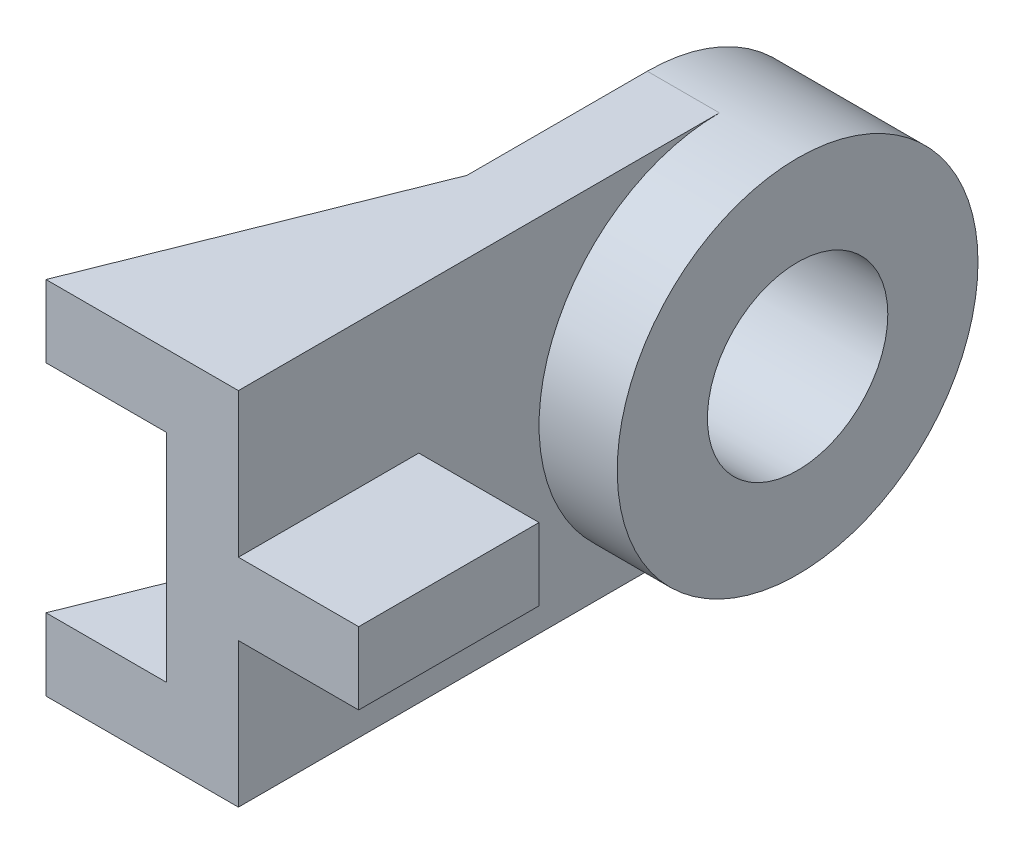
ISO-10303-21;
HEADER;
FILE_DESCRIPTION(('STEP AP214'),'2;1');
FILE_NAME('part.step','',(''),(''),'','','');
FILE_SCHEMA(('AUTOMOTIVE_DESIGN { 1 0 10303 214 1 1 1 1 }'));
ENDSEC;
DATA;
#1=APPLICATION_CONTEXT('core data for automotive mechanical design processes');
#2=APPLICATION_PROTOCOL_DEFINITION('international standard','automotive_design',2000,#1);
#3=PRODUCT_CONTEXT('',#1,'mechanical');
#4=PRODUCT('Part','Part','',(#3));
#5=PRODUCT_RELATED_PRODUCT_CATEGORY('part','',(#4));
#6=PRODUCT_DEFINITION_FORMATION('','',#4);
#7=PRODUCT_DEFINITION_CONTEXT('part definition',#1,'design');
#8=PRODUCT_DEFINITION('design','',#6,#7);
#9=PRODUCT_DEFINITION_SHAPE('','',#8);
#10=(LENGTH_UNIT() NAMED_UNIT(*) SI_UNIT(.MILLI.,.METRE.));
#11=(NAMED_UNIT(*) PLANE_ANGLE_UNIT() SI_UNIT($,.RADIAN.));
#12=(NAMED_UNIT(*) SI_UNIT($,.STERADIAN.) SOLID_ANGLE_UNIT());
#13=UNCERTAINTY_MEASURE_WITH_UNIT(LENGTH_MEASURE(1.E-05),#10,'distance_accuracy_value','');
#14=(GEOMETRIC_REPRESENTATION_CONTEXT(3) GLOBAL_UNCERTAINTY_ASSIGNED_CONTEXT((#13)) GLOBAL_UNIT_ASSIGNED_CONTEXT((#10,
#11,#12)) REPRESENTATION_CONTEXT('',''));
#15=CARTESIAN_POINT('',(0.,0.,0.));
#16=DIRECTION('',(0.,0.,1.));
#17=DIRECTION('',(1.,0.,0.));
#18=AXIS2_PLACEMENT_3D('',#15,#16,#17);
#19=CARTESIAN_POINT('',(0.,0.,0.));
#20=DIRECTION('',(1.,0.,0.));
#21=DIRECTION('',(0.,0.,-1.));
#22=AXIS2_PLACEMENT_3D('',#19,#20,#21);
#23=PLANE('',#22);
#24=CARTESIAN_POINT('',(0.,0.,0.));
#25=DIRECTION('',(1.,0.,0.));
#26=DIRECTION('',(0.,0.,-1.));
#27=AXIS2_PLACEMENT_3D('',#24,#25,#26);
#28=CIRCLE('',#27,15.);
#29=CARTESIAN_POINT('',(0.,0.,-15.));
#30=VERTEX_POINT('',#29);
#31=EDGE_CURVE('E152',#30,#30,#28,.T.);
#32=ORIENTED_EDGE('',*,*,#31,.T.);
#33=EDGE_LOOP('',(#32));
#34=FACE_BOUND('',#33,.T.);
#35=DIRECTION('',(0.,-1.,0.));
#36=VECTOR('',#35,1.);
#37=CARTESIAN_POINT('',(0.,-18.,30.));
#38=LINE('',#37,#36);
#39=CARTESIAN_POINT('',(0.,-18.,30.));
#40=VERTEX_POINT('',#39);
#41=CARTESIAN_POINT('',(0.,-30.,30.));
#42=VERTEX_POINT('',#41);
#43=EDGE_CURVE('E55',#40,#42,#38,.T.);
#44=ORIENTED_EDGE('',*,*,#43,.F.);
#45=DIRECTION('',(0.,0.,-1.));
#46=VECTOR('',#45,1.);
#47=CARTESIAN_POINT('',(0.,-18.,30.));
#48=LINE('',#47,#46);
#49=CARTESIAN_POINT('',(0.,-18.,80.));
#50=VERTEX_POINT('',#49);
#51=EDGE_CURVE('E133',#50,#40,#48,.T.);
#52=ORIENTED_EDGE('',*,*,#51,.F.);
#53=DIRECTION('',(0.,1.,0.));
#54=VECTOR('',#53,1.);
#55=CARTESIAN_POINT('',(0.,0.,80.));
#56=LINE('',#55,#54);
#57=CARTESIAN_POINT('',(0.,18.,80.));
#58=VERTEX_POINT('',#57);
#59=EDGE_CURVE('E146',#50,#58,#56,.T.);
#60=ORIENTED_EDGE('',*,*,#59,.T.);
#61=DIRECTION('',(0.,0.,-1.));
#62=VECTOR('',#61,1.);
#63=CARTESIAN_POINT('',(0.,18.,30.));
#64=LINE('',#63,#62);
#65=CARTESIAN_POINT('',(0.,18.,30.));
#66=VERTEX_POINT('',#65);
#67=EDGE_CURVE('E155',#58,#66,#64,.T.);
#68=ORIENTED_EDGE('',*,*,#67,.T.);
#69=DIRECTION('',(0.,1.,0.));
#70=VECTOR('',#69,1.);
#71=CARTESIAN_POINT('',(0.,18.,30.));
#72=LINE('',#71,#70);
#73=CARTESIAN_POINT('',(0.,30.,30.));
#74=VERTEX_POINT('',#73);
#75=EDGE_CURVE('E163',#66,#74,#72,.T.);
#76=ORIENTED_EDGE('',*,*,#75,.T.);
#77=DIRECTION('',(0.,0.,-1.));
#78=VECTOR('',#77,1.);
#79=CARTESIAN_POINT('',(0.,30.,0.));
#80=LINE('',#79,#78);
#81=CARTESIAN_POINT('',(0.,30.,0.));
#82=VERTEX_POINT('',#81);
#83=EDGE_CURVE('E202',#74,#82,#80,.T.);
#84=ORIENTED_EDGE('',*,*,#83,.T.);
#85=CARTESIAN_POINT('',(0.,0.,0.));
#86=DIRECTION('',(1.,0.,0.));
#87=DIRECTION('',(0.,0.,-1.));
#88=AXIS2_PLACEMENT_3D('',#85,#86,#87);
#89=CIRCLE('',#88,30.);
#90=CARTESIAN_POINT('',(0.,-30.,0.));
#91=VERTEX_POINT('',#90);
#92=EDGE_CURVE('E198',#91,#82,#89,.T.);
#93=ORIENTED_EDGE('',*,*,#92,.F.);
#94=DIRECTION('',(0.,0.,1.));
#95=VECTOR('',#94,1.);
#96=CARTESIAN_POINT('',(0.,-30.,0.));
#97=LINE('',#96,#95);
#98=EDGE_CURVE('E60',#91,#42,#97,.T.);
#99=ORIENTED_EDGE('',*,*,#98,.T.);
#100=EDGE_LOOP('',(#44,#52,#60,#68,#76,#84,#93,#99));
#101=FACE_BOUND('',#100,.T.);
#102=ADVANCED_FACE('F39',(#34,#101),#23,.F.);
#103=CARTESIAN_POINT('',(12.,30.,0.));
#104=DIRECTION('',(0.,1.,0.));
#105=DIRECTION('',(0.,0.,1.));
#106=AXIS2_PLACEMENT_3D('',#103,#104,#105);
#107=PLANE('',#106);
#108=ORIENTED_EDGE('',*,*,#83,.F.);
#109=DIRECTION('',(-0.371390676354104,0.,0.928476690885259));
#110=VECTOR('',#109,1.);
#111=CARTESIAN_POINT('',(-20.,30.,80.));
#112=LINE('',#111,#110);
#113=CARTESIAN_POINT('',(-20.,30.,80.));
#114=VERTEX_POINT('',#113);
#115=EDGE_CURVE('E153',#74,#114,#112,.T.);
#116=ORIENTED_EDGE('',*,*,#115,.T.);
#117=DIRECTION('',(-1.,0.,0.));
#118=VECTOR('',#117,1.);
#119=CARTESIAN_POINT('',(12.,30.,80.));
#120=LINE('',#119,#118);
#121=CARTESIAN_POINT('',(12.,30.,80.));
#122=VERTEX_POINT('',#121);
#123=EDGE_CURVE('E48',#122,#114,#120,.T.);
#124=ORIENTED_EDGE('',*,*,#123,.F.);
#125=DIRECTION('',(0.,0.,-1.));
#126=VECTOR('',#125,1.);
#127=CARTESIAN_POINT('',(12.,30.,0.));
#128=LINE('',#127,#126);
#129=CARTESIAN_POINT('',(12.,30.,0.));
#130=VERTEX_POINT('',#129);
#131=EDGE_CURVE('E207',#122,#130,#128,.T.);
#132=ORIENTED_EDGE('',*,*,#131,.T.);
#133=DIRECTION('',(-1.,0.,0.));
#134=VECTOR('',#133,1.);
#135=CARTESIAN_POINT('',(12.,30.,0.));
#136=LINE('',#135,#134);
#137=EDGE_CURVE('E11',#130,#82,#136,.T.);
#138=ORIENTED_EDGE('',*,*,#137,.T.);
#139=EDGE_LOOP('',(#108,#116,#124,#132,#138));
#140=FACE_BOUND('',#139,.T.);
#141=ADVANCED_FACE('F41',(#140),#107,.T.);
#142=CARTESIAN_POINT('',(12.,0.,80.));
#143=DIRECTION('',(0.,0.,1.));
#144=DIRECTION('',(1.,0.,0.));
#145=AXIS2_PLACEMENT_3D('',#142,#143,#144);
#146=PLANE('',#145);
#147=ORIENTED_EDGE('',*,*,#59,.F.);
#148=DIRECTION('',(1.,0.,0.));
#149=VECTOR('',#148,1.);
#150=CARTESIAN_POINT('',(0.,-18.,80.));
#151=LINE('',#150,#149);
#152=CARTESIAN_POINT('',(-20.,-18.,80.));
#153=VERTEX_POINT('',#152);
#154=EDGE_CURVE('E132',#153,#50,#151,.T.);
#155=ORIENTED_EDGE('',*,*,#154,.F.);
#156=DIRECTION('',(0.,-1.,0.));
#157=VECTOR('',#156,1.);
#158=CARTESIAN_POINT('',(-20.,-18.,80.));
#159=LINE('',#158,#157);
#160=CARTESIAN_POINT('',(-20.,-30.,80.));
#161=VERTEX_POINT('',#160);
#162=EDGE_CURVE('E135',#153,#161,#159,.T.);
#163=ORIENTED_EDGE('',*,*,#162,.T.);
#164=DIRECTION('',(-1.,0.,0.));
#165=VECTOR('',#164,1.);
#166=CARTESIAN_POINT('',(12.,-30.,80.));
#167=LINE('',#166,#165);
#168=CARTESIAN_POINT('',(12.,-30.,80.));
#169=VERTEX_POINT('',#168);
#170=EDGE_CURVE('E223',#169,#161,#167,.T.);
#171=ORIENTED_EDGE('',*,*,#170,.F.);
#172=DIRECTION('',(0.,1.,0.));
#173=VECTOR('',#172,1.);
#174=CARTESIAN_POINT('',(12.,0.,80.));
#175=LINE('',#174,#173);
#176=CARTESIAN_POINT('',(12.,-6.,80.));
#177=VERTEX_POINT('',#176);
#178=EDGE_CURVE('E211',#169,#177,#175,.T.);
#179=ORIENTED_EDGE('',*,*,#178,.T.);
#180=DIRECTION('',(1.,0.,0.));
#181=VECTOR('',#180,1.);
#182=CARTESIAN_POINT('',(12.,-6.,80.));
#183=LINE('',#182,#181);
#184=CARTESIAN_POINT('',(32.,-6.,80.));
#185=VERTEX_POINT('',#184);
#186=EDGE_CURVE('E185',#177,#185,#183,.T.);
#187=ORIENTED_EDGE('',*,*,#186,.T.);
#188=DIRECTION('',(0.,-1.,0.));
#189=VECTOR('',#188,1.);
#190=CARTESIAN_POINT('',(32.,6.,80.));
#191=LINE('',#190,#189);
#192=CARTESIAN_POINT('',(32.,6.,80.));
#193=VERTEX_POINT('',#192);
#194=EDGE_CURVE('E195',#193,#185,#191,.T.);
#195=ORIENTED_EDGE('',*,*,#194,.F.);
#196=DIRECTION('',(1.,0.,0.));
#197=VECTOR('',#196,1.);
#198=CARTESIAN_POINT('',(12.,6.,80.));
#199=LINE('',#198,#197);
#200=CARTESIAN_POINT('',(12.,6.,80.));
#201=VERTEX_POINT('',#200);
#202=EDGE_CURVE('E175',#201,#193,#199,.T.);
#203=ORIENTED_EDGE('',*,*,#202,.F.);
#204=EDGE_CURVE('E210',#201,#122,#175,.T.);
#205=ORIENTED_EDGE('',*,*,#204,.T.);
#206=ORIENTED_EDGE('',*,*,#123,.T.);
#207=DIRECTION('',(0.,1.,0.));
#208=VECTOR('',#207,1.);
#209=CARTESIAN_POINT('',(-20.,18.,80.));
#210=LINE('',#209,#208);
#211=CARTESIAN_POINT('',(-20.,18.,80.));
#212=VERTEX_POINT('',#211);
#213=EDGE_CURVE('E166',#212,#114,#210,.T.);
#214=ORIENTED_EDGE('',*,*,#213,.F.);
#215=DIRECTION('',(1.,0.,0.));
#216=VECTOR('',#215,1.);
#217=CARTESIAN_POINT('',(0.,18.,80.));
#218=LINE('',#217,#216);
#219=EDGE_CURVE('E161',#212,#58,#218,.T.);
#220=ORIENTED_EDGE('',*,*,#219,.T.);
#221=EDGE_LOOP('',(#147,#155,#163,#171,#179,#187,#195,#203,#205,#206,#214,#220));
#222=FACE_BOUND('',#221,.T.);
#223=ADVANCED_FACE('F144',(#222),#146,.T.);
#224=CARTESIAN_POINT('',(12.,-30.,0.));
#225=DIRECTION('',(0.,-1.,0.));
#226=DIRECTION('',(0.,0.,-1.));
#227=AXIS2_PLACEMENT_3D('',#224,#225,#226);
#228=PLANE('',#227);
#229=ORIENTED_EDGE('',*,*,#98,.F.);
#230=DIRECTION('',(-1.,0.,0.));
#231=VECTOR('',#230,1.);
#232=CARTESIAN_POINT('',(12.,-30.,0.));
#233=LINE('',#232,#231);
#234=CARTESIAN_POINT('',(12.,-30.,0.));
#235=VERTEX_POINT('',#234);
#236=EDGE_CURVE('E217',#235,#91,#233,.T.);
#237=ORIENTED_EDGE('',*,*,#236,.F.);
#238=DIRECTION('',(0.,0.,1.));
#239=VECTOR('',#238,1.);
#240=CARTESIAN_POINT('',(12.,-30.,0.));
#241=LINE('',#240,#239);
#242=EDGE_CURVE('E214',#235,#169,#241,.T.);
#243=ORIENTED_EDGE('',*,*,#242,.T.);
#244=ORIENTED_EDGE('',*,*,#170,.T.);
#245=DIRECTION('',(-0.371390676354104,0.,0.928476690885259));
#246=VECTOR('',#245,1.);
#247=CARTESIAN_POINT('',(-20.,-30.,80.));
#248=LINE('',#247,#246);
#249=EDGE_CURVE('E140',#42,#161,#248,.T.);
#250=ORIENTED_EDGE('',*,*,#249,.F.);
#251=EDGE_LOOP('',(#229,#237,#243,#244,#250));
#252=FACE_BOUND('',#251,.T.);
#253=ADVANCED_FACE('F240',(#252),#228,.T.);
#254=CARTESIAN_POINT('',(12.,0.,0.));
#255=DIRECTION('',(1.,0.,0.));
#256=DIRECTION('',(0.,0.,-1.));
#257=AXIS2_PLACEMENT_3D('',#254,#255,#256);
#258=PLANE('',#257);
#259=DIRECTION('',(0.,0.,1.));
#260=VECTOR('',#259,1.);
#261=CARTESIAN_POINT('',(12.,6.,50.));
#262=LINE('',#261,#260);
#263=CARTESIAN_POINT('',(12.,6.,50.));
#264=VERTEX_POINT('',#263);
#265=EDGE_CURVE('E172',#264,#201,#262,.T.);
#266=ORIENTED_EDGE('',*,*,#265,.F.);
#267=DIRECTION('',(0.,-1.,0.));
#268=VECTOR('',#267,1.);
#269=CARTESIAN_POINT('',(12.,6.,50.));
#270=LINE('',#269,#268);
#271=CARTESIAN_POINT('',(12.,-6.,50.));
#272=VERTEX_POINT('',#271);
#273=EDGE_CURVE('E182',#264,#272,#270,.T.);
#274=ORIENTED_EDGE('',*,*,#273,.T.);
#275=DIRECTION('',(0.,0.,1.));
#276=VECTOR('',#275,1.);
#277=CARTESIAN_POINT('',(12.,-6.,50.));
#278=LINE('',#277,#276);
#279=EDGE_CURVE('E169',#272,#177,#278,.T.);
#280=ORIENTED_EDGE('',*,*,#279,.T.);
#281=ORIENTED_EDGE('',*,*,#178,.F.);
#282=ORIENTED_EDGE('',*,*,#242,.F.);
#283=CARTESIAN_POINT('',(12.,0.,0.));
#284=DIRECTION('',(1.,0.,0.));
#285=DIRECTION('',(0.,0.,-1.));
#286=AXIS2_PLACEMENT_3D('',#283,#284,#285);
#287=CIRCLE('',#286,30.);
#288=EDGE_CURVE('E205',#130,#235,#287,.T.);
#289=ORIENTED_EDGE('',*,*,#288,.F.);
#290=ORIENTED_EDGE('',*,*,#131,.F.);
#291=ORIENTED_EDGE('',*,*,#204,.F.);
#292=EDGE_LOOP('',(#266,#274,#280,#281,#282,#289,#290,#291));
#293=FACE_BOUND('',#292,.T.);
#294=ADVANCED_FACE('F244',(#293),#258,.T.);
#295=CARTESIAN_POINT('',(25.,0.,0.));
#296=DIRECTION('',(-1.,0.,0.));
#297=DIRECTION('',(0.,0.,1.));
#298=AXIS2_PLACEMENT_3D('',#295,#296,#297);
#299=CYLINDRICAL_SURFACE('',#298,30.);
#300=CARTESIAN_POINT('',(25.,0.,0.));
#301=DIRECTION('',(1.,0.,0.));
#302=DIRECTION('',(0.,0.,-1.));
#303=AXIS2_PLACEMENT_3D('',#300,#301,#302);
#304=CIRCLE('',#303,30.);
#305=CARTESIAN_POINT('',(25.,0.,-30.));
#306=VERTEX_POINT('',#305);
#307=EDGE_CURVE('E199',#306,#306,#304,.T.);
#308=ORIENTED_EDGE('',*,*,#307,.F.);
#309=EDGE_LOOP('',(#308));
#310=FACE_BOUND('',#309,.T.);
#311=ORIENTED_EDGE('',*,*,#92,.T.);
#312=ORIENTED_EDGE('',*,*,#137,.F.);
#313=ORIENTED_EDGE('',*,*,#288,.T.);
#314=ORIENTED_EDGE('',*,*,#236,.T.);
#315=EDGE_LOOP('',(#311,#312,#313,#314));
#316=FACE_BOUND('',#315,.T.);
#317=ADVANCED_FACE('F235',(#310,#316),#299,.T.);
#318=CARTESIAN_POINT('',(25.,0.,0.));
#319=DIRECTION('',(1.,0.,0.));
#320=DIRECTION('',(0.,0.,-1.));
#321=AXIS2_PLACEMENT_3D('',#318,#319,#320);
#322=PLANE('',#321);
#323=CARTESIAN_POINT('',(25.,0.,0.));
#324=DIRECTION('',(1.,0.,0.));
#325=DIRECTION('',(0.,0.,-1.));
#326=AXIS2_PLACEMENT_3D('',#323,#324,#325);
#327=CIRCLE('',#326,15.);
#328=CARTESIAN_POINT('',(25.,0.,-15.));
#329=VERTEX_POINT('',#328);
#330=EDGE_CURVE('E43',#329,#329,#327,.T.);
#331=ORIENTED_EDGE('',*,*,#330,.F.);
#332=EDGE_LOOP('',(#331));
#333=FACE_BOUND('',#332,.T.);
#334=ORIENTED_EDGE('',*,*,#307,.T.);
#335=EDGE_LOOP('',(#334));
#336=FACE_BOUND('',#335,.T.);
#337=ADVANCED_FACE('F268',(#333,#336),#322,.T.);
#338=CARTESIAN_POINT('',(32.,6.,80.));
#339=DIRECTION('',(-1.,0.,0.));
#340=DIRECTION('',(0.,0.,1.));
#341=AXIS2_PLACEMENT_3D('',#338,#339,#340);
#342=PLANE('',#341);
#343=DIRECTION('',(0.,0.,-1.));
#344=VECTOR('',#343,1.);
#345=CARTESIAN_POINT('',(32.,-6.,80.));
#346=LINE('',#345,#344);
#347=CARTESIAN_POINT('',(32.,-6.,50.));
#348=VERTEX_POINT('',#347);
#349=EDGE_CURVE('E187',#185,#348,#346,.T.);
#350=ORIENTED_EDGE('',*,*,#349,.T.);
#351=DIRECTION('',(0.,-1.,0.));
#352=VECTOR('',#351,1.);
#353=CARTESIAN_POINT('',(32.,6.,50.));
#354=LINE('',#353,#352);
#355=CARTESIAN_POINT('',(32.,6.,50.));
#356=VERTEX_POINT('',#355);
#357=EDGE_CURVE('E192',#356,#348,#354,.T.);
#358=ORIENTED_EDGE('',*,*,#357,.F.);
#359=DIRECTION('',(0.,0.,-1.));
#360=VECTOR('',#359,1.);
#361=CARTESIAN_POINT('',(32.,6.,80.));
#362=LINE('',#361,#360);
#363=EDGE_CURVE('E178',#193,#356,#362,.T.);
#364=ORIENTED_EDGE('',*,*,#363,.F.);
#365=ORIENTED_EDGE('',*,*,#194,.T.);
#366=EDGE_LOOP('',(#350,#358,#364,#365));
#367=FACE_BOUND('',#366,.T.);
#368=ADVANCED_FACE('F254',(#367),#342,.F.);
#369=CARTESIAN_POINT('',(32.,6.,50.));
#370=DIRECTION('',(0.,0.,1.));
#371=DIRECTION('',(1.,0.,0.));
#372=AXIS2_PLACEMENT_3D('',#369,#370,#371);
#373=PLANE('',#372);
#374=DIRECTION('',(-1.,0.,0.));
#375=VECTOR('',#374,1.);
#376=CARTESIAN_POINT('',(32.,-6.,50.));
#377=LINE('',#376,#375);
#378=EDGE_CURVE('E176',#348,#272,#377,.T.);
#379=ORIENTED_EDGE('',*,*,#378,.T.);
#380=ORIENTED_EDGE('',*,*,#273,.F.);
#381=DIRECTION('',(-1.,0.,0.));
#382=VECTOR('',#381,1.);
#383=CARTESIAN_POINT('',(32.,6.,50.));
#384=LINE('',#383,#382);
#385=EDGE_CURVE('E180',#356,#264,#384,.T.);
#386=ORIENTED_EDGE('',*,*,#385,.F.);
#387=ORIENTED_EDGE('',*,*,#357,.T.);
#388=EDGE_LOOP('',(#379,#380,#386,#387));
#389=FACE_BOUND('',#388,.T.);
#390=ADVANCED_FACE('F260',(#389),#373,.F.);
#391=CARTESIAN_POINT('',(0.,6.,0.));
#392=DIRECTION('',(0.,1.,0.));
#393=DIRECTION('',(0.,0.,1.));
#394=AXIS2_PLACEMENT_3D('',#391,#392,#393);
#395=PLANE('',#394);
#396=ORIENTED_EDGE('',*,*,#265,.T.);
#397=ORIENTED_EDGE('',*,*,#202,.T.);
#398=ORIENTED_EDGE('',*,*,#363,.T.);
#399=ORIENTED_EDGE('',*,*,#385,.T.);
#400=EDGE_LOOP('',(#396,#397,#398,#399));
#401=FACE_BOUND('',#400,.T.);
#402=ADVANCED_FACE('F258',(#401),#395,.T.);
#403=CARTESIAN_POINT('',(0.,-6.,0.));
#404=DIRECTION('',(0.,1.,0.));
#405=DIRECTION('',(0.,0.,1.));
#406=AXIS2_PLACEMENT_3D('',#403,#404,#405);
#407=PLANE('',#406);
#408=ORIENTED_EDGE('',*,*,#279,.F.);
#409=ORIENTED_EDGE('',*,*,#378,.F.);
#410=ORIENTED_EDGE('',*,*,#349,.F.);
#411=ORIENTED_EDGE('',*,*,#186,.F.);
#412=EDGE_LOOP('',(#408,#409,#410,#411));
#413=FACE_BOUND('',#412,.T.);
#414=ADVANCED_FACE('F249',(#413),#407,.F.);
#415=CARTESIAN_POINT('',(-20.,18.,80.));
#416=DIRECTION('',(-0.928476690885259,0.,-0.371390676354104));
#417=DIRECTION('',(-0.371390676354104,0.,0.928476690885259));
#418=AXIS2_PLACEMENT_3D('',#415,#416,#417);
#419=PLANE('',#418);
#420=ORIENTED_EDGE('',*,*,#115,.F.);
#421=ORIENTED_EDGE('',*,*,#75,.F.);
#422=DIRECTION('',(-0.371390676354104,0.,0.928476690885259));
#423=VECTOR('',#422,1.);
#424=CARTESIAN_POINT('',(-20.,18.,80.));
#425=LINE('',#424,#423);
#426=EDGE_CURVE('E158',#66,#212,#425,.T.);
#427=ORIENTED_EDGE('',*,*,#426,.T.);
#428=ORIENTED_EDGE('',*,*,#213,.T.);
#429=EDGE_LOOP('',(#420,#421,#427,#428));
#430=FACE_BOUND('',#429,.T.);
#431=ADVANCED_FACE('F230',(#430),#419,.T.);
#432=CARTESIAN_POINT('',(0.,18.,0.));
#433=DIRECTION('',(0.,-1.,0.));
#434=DIRECTION('',(0.,0.,-1.));
#435=AXIS2_PLACEMENT_3D('',#432,#433,#434);
#436=PLANE('',#435);
#437=ORIENTED_EDGE('',*,*,#67,.F.);
#438=ORIENTED_EDGE('',*,*,#219,.F.);
#439=ORIENTED_EDGE('',*,*,#426,.F.);
#440=EDGE_LOOP('',(#437,#438,#439));
#441=FACE_BOUND('',#440,.T.);
#442=ADVANCED_FACE('F293',(#441),#436,.T.);
#443=CARTESIAN_POINT('',(-20.,-18.,80.));
#444=DIRECTION('',(0.928476690885259,0.,0.371390676354104));
#445=DIRECTION('',(0.371390676354104,0.,-0.928476690885259));
#446=AXIS2_PLACEMENT_3D('',#443,#444,#445);
#447=PLANE('',#446);
#448=ORIENTED_EDGE('',*,*,#249,.T.);
#449=ORIENTED_EDGE('',*,*,#162,.F.);
#450=DIRECTION('',(-0.371390676354104,0.,0.928476690885259));
#451=VECTOR('',#450,1.);
#452=CARTESIAN_POINT('',(-20.,-18.,80.));
#453=LINE('',#452,#451);
#454=EDGE_CURVE('E128',#40,#153,#453,.T.);
#455=ORIENTED_EDGE('',*,*,#454,.F.);
#456=ORIENTED_EDGE('',*,*,#43,.T.);
#457=EDGE_LOOP('',(#448,#449,#455,#456));
#458=FACE_BOUND('',#457,.T.);
#459=ADVANCED_FACE('F139',(#458),#447,.F.);
#460=CARTESIAN_POINT('',(0.,-18.,0.));
#461=DIRECTION('',(0.,1.,0.));
#462=DIRECTION('',(0.,0.,-1.));
#463=AXIS2_PLACEMENT_3D('',#460,#461,#462);
#464=PLANE('',#463);
#465=ORIENTED_EDGE('',*,*,#51,.T.);
#466=ORIENTED_EDGE('',*,*,#454,.T.);
#467=ORIENTED_EDGE('',*,*,#154,.T.);
#468=EDGE_LOOP('',(#465,#466,#467));
#469=FACE_BOUND('',#468,.T.);
#470=ADVANCED_FACE('F130',(#469),#464,.T.);
#471=CARTESIAN_POINT('',(-20.,0.,0.));
#472=DIRECTION('',(1.,0.,0.));
#473=DIRECTION('',(0.,0.,-1.));
#474=AXIS2_PLACEMENT_3D('',#471,#472,#473);
#475=CYLINDRICAL_SURFACE('',#474,15.);
#476=CARTESIAN_POINT('',(25.,0.,-15.));
#477=CARTESIAN_POINT('',(24.7395833333333,0.,-15.));
#478=CARTESIAN_POINT('',(24.4791666666667,0.,-15.));
#479=CARTESIAN_POINT('',(23.9583333333333,0.,-15.));
#480=CARTESIAN_POINT('',(23.6979166666667,0.,-15.));
#481=CARTESIAN_POINT('',(23.1770833333333,0.,-15.));
#482=CARTESIAN_POINT('',(22.9166666666667,0.,-15.));
#483=CARTESIAN_POINT('',(22.3958333333333,0.,-15.));
#484=CARTESIAN_POINT('',(22.1354166666667,0.,-15.));
#485=CARTESIAN_POINT('',(21.6145833333333,0.,-15.));
#486=CARTESIAN_POINT('',(21.3541666666667,0.,-15.));
#487=CARTESIAN_POINT('',(20.8333333333333,0.,-15.));
#488=CARTESIAN_POINT('',(20.5729166666667,0.,-15.));
#489=CARTESIAN_POINT('',(20.0520833333333,0.,-15.));
#490=CARTESIAN_POINT('',(19.7916666666667,0.,-15.));
#491=CARTESIAN_POINT('',(19.2708333333333,0.,-15.));
#492=CARTESIAN_POINT('',(19.0104166666667,0.,-15.));
#493=CARTESIAN_POINT('',(18.4895833333333,0.,-15.));
#494=CARTESIAN_POINT('',(18.2291666666667,0.,-15.));
#495=CARTESIAN_POINT('',(17.7083333333333,0.,-15.));
#496=CARTESIAN_POINT('',(17.4479166666667,0.,-15.));
#497=CARTESIAN_POINT('',(16.9270833333333,0.,-15.));
#498=CARTESIAN_POINT('',(16.6666666666667,0.,-15.));
#499=CARTESIAN_POINT('',(16.1458333333333,0.,-15.));
#500=CARTESIAN_POINT('',(15.8854166666667,0.,-15.));
#501=CARTESIAN_POINT('',(15.3645833333333,0.,-15.));
#502=CARTESIAN_POINT('',(15.1041666666667,0.,-15.));
#503=CARTESIAN_POINT('',(14.5833333333333,0.,-15.));
#504=CARTESIAN_POINT('',(14.3229166666667,0.,-15.));
#505=CARTESIAN_POINT('',(13.8020833333333,0.,-15.));
#506=CARTESIAN_POINT('',(13.5416666666667,0.,-15.));
#507=CARTESIAN_POINT('',(13.0208333333333,0.,-15.));
#508=CARTESIAN_POINT('',(12.7604166666667,0.,-15.));
#509=CARTESIAN_POINT('',(12.2395833333333,0.,-15.));
#510=CARTESIAN_POINT('',(11.9791666666667,0.,-15.));
#511=CARTESIAN_POINT('',(11.4583333333333,0.,-15.));
#512=CARTESIAN_POINT('',(11.1979166666667,0.,-15.));
#513=CARTESIAN_POINT('',(10.6770833333333,0.,-15.));
#514=CARTESIAN_POINT('',(10.4166666666667,0.,-15.));
#515=CARTESIAN_POINT('',(9.89583333333333,0.,-15.));
#516=CARTESIAN_POINT('',(9.63541666666666,0.,-15.));
#517=CARTESIAN_POINT('',(9.11458333333333,0.,-15.));
#518=CARTESIAN_POINT('',(8.85416666666666,0.,-15.));
#519=CARTESIAN_POINT('',(8.33333333333333,0.,-15.));
#520=CARTESIAN_POINT('',(8.07291666666666,0.,-15.));
#521=CARTESIAN_POINT('',(7.55208333333333,0.,-15.));
#522=CARTESIAN_POINT('',(7.29166666666666,0.,-15.));
#523=CARTESIAN_POINT('',(6.77083333333333,0.,-15.));
#524=CARTESIAN_POINT('',(6.51041666666666,0.,-15.));
#525=CARTESIAN_POINT('',(5.98958333333333,0.,-15.));
#526=CARTESIAN_POINT('',(5.72916666666666,0.,-15.));
#527=CARTESIAN_POINT('',(5.20833333333333,0.,-15.));
#528=CARTESIAN_POINT('',(4.94791666666666,0.,-15.));
#529=CARTESIAN_POINT('',(4.42708333333333,0.,-15.));
#530=CARTESIAN_POINT('',(4.16666666666666,0.,-15.));
#531=CARTESIAN_POINT('',(3.64583333333333,0.,-15.));
#532=CARTESIAN_POINT('',(3.38541666666666,0.,-15.));
#533=CARTESIAN_POINT('',(2.86458333333333,0.,-15.));
#534=CARTESIAN_POINT('',(2.60416666666666,0.,-15.));
#535=CARTESIAN_POINT('',(2.08333333333333,0.,-15.));
#536=CARTESIAN_POINT('',(1.82291666666666,0.,-15.));
#537=CARTESIAN_POINT('',(1.30208333333333,0.,-15.));
#538=CARTESIAN_POINT('',(1.04166666666666,0.,-15.));
#539=CARTESIAN_POINT('',(0.52083333333333,0.,-15.));
#540=CARTESIAN_POINT('',(0.260416666666664,0.,-15.));
#541=CARTESIAN_POINT('',(0.,0.,-15.));
#542=B_SPLINE_CURVE_WITH_KNOTS('',3,(#476,#477,#478,#479,#480,#481,#482,#483,#484,#485,#486,
#487,#488,#489,#490,#491,#492,#493,#494,#495,#496,#497,#498,#499,#500,#501,#502,#503,#504,#505,
#506,#507,#508,#509,#510,#511,#512,#513,#514,#515,#516,#517,#518,#519,#520,#521,#522,#523,#524,
#525,#526,#527,#528,#529,#530,#531,#532,#533,#534,#535,#536,#537,#538,#539,#540,#541),
.UNSPECIFIED.,.F.,.F.,(4,2,2,2,2,2,2,2,2,2,2,2,2,2,2,2,2,2,2,2,2,2,2,2,2,2,2,2,2,2,2,2,4),(0.,
0.781249999999997,1.5625,2.34375,3.125,3.90625,4.6875,5.46875,6.25,7.03125,7.8125,8.59375,9.375,
10.15625,10.9375,11.71875,12.5,13.28125,14.0625,14.84375,15.625,16.40625,17.1875,17.96875,18.75,
19.53125,20.3125,21.09375,21.875,22.65625,23.4375,24.21875,25.),.UNSPECIFIED.);
#543=EDGE_CURVE('BSEAM310',#329,#30,#542,.T.);
#544=ORIENTED_EDGE('',*,*,#330,.T.);
#545=ORIENTED_EDGE('',*,*,#31,.F.);
#546=ORIENTED_EDGE('',*,*,#543,.T.);
#547=ORIENTED_EDGE('',*,*,#543,.F.);
#548=EDGE_LOOP('',(#544,#546,#545,#547));
#549=FACE_BOUND('',#548,.T.);
#550=ADVANCED_FACE('F310',(#549),#475,.F.);
#551=CLOSED_SHELL('',(#102,#141,#223,#253,#294,#317,#337,#368,#390,#402,#414,#431,#442,#459,
#470,#550));
#552=MANIFOLD_SOLID_BREP('B2',#551);
#553=ADVANCED_BREP_SHAPE_REPRESENTATION('',(#18,#552),#14);
#554=SHAPE_DEFINITION_REPRESENTATION(#9,#553);
ENDSEC;
END-ISO-10303-21;
